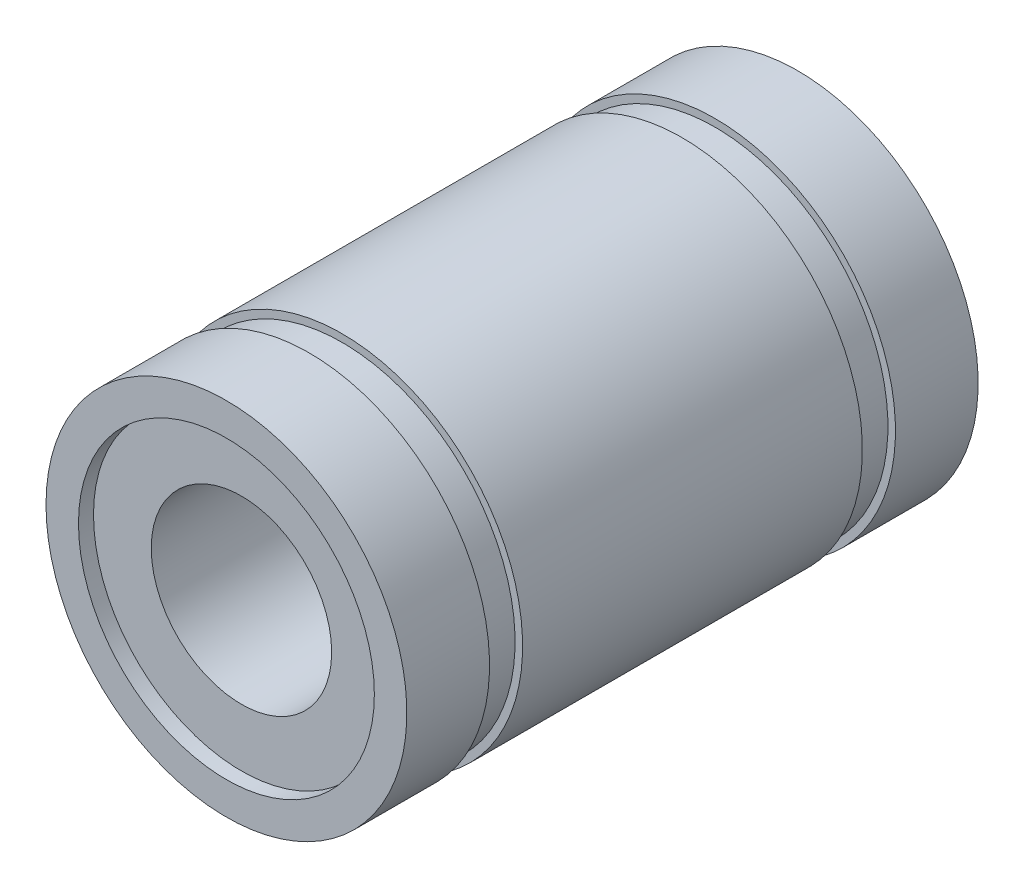
ISO-10303-21;
HEADER;
FILE_DESCRIPTION(('STEP AP214'),'2;1');
FILE_NAME('part.step','',(''),(''),'','','');
FILE_SCHEMA(('AUTOMOTIVE_DESIGN { 1 0 10303 214 1 1 1 1 }'));
ENDSEC;
DATA;
#1=APPLICATION_CONTEXT('core data for automotive mechanical design processes');
#2=APPLICATION_PROTOCOL_DEFINITION('international standard','automotive_design',2000,#1);
#3=PRODUCT_CONTEXT('',#1,'mechanical');
#4=PRODUCT('Part','Part','',(#3));
#5=PRODUCT_RELATED_PRODUCT_CATEGORY('part','',(#4));
#6=PRODUCT_DEFINITION_FORMATION('','',#4);
#7=PRODUCT_DEFINITION_CONTEXT('part definition',#1,'design');
#8=PRODUCT_DEFINITION('design','',#6,#7);
#9=PRODUCT_DEFINITION_SHAPE('','',#8);
#10=(LENGTH_UNIT() NAMED_UNIT(*) SI_UNIT(.MILLI.,.METRE.));
#11=(NAMED_UNIT(*) PLANE_ANGLE_UNIT() SI_UNIT($,.RADIAN.));
#12=(NAMED_UNIT(*) SI_UNIT($,.STERADIAN.) SOLID_ANGLE_UNIT());
#13=UNCERTAINTY_MEASURE_WITH_UNIT(LENGTH_MEASURE(1.E-05),#10,'distance_accuracy_value','');
#14=(GEOMETRIC_REPRESENTATION_CONTEXT(3) GLOBAL_UNCERTAINTY_ASSIGNED_CONTEXT((#13)) GLOBAL_UNIT_ASSIGNED_CONTEXT((#10,
#11,#12)) REPRESENTATION_CONTEXT('',''));
#15=CARTESIAN_POINT('',(0.,0.,0.));
#16=DIRECTION('',(0.,0.,1.));
#17=DIRECTION('',(1.,0.,0.));
#18=AXIS2_PLACEMENT_3D('',#15,#16,#17);
#19=CARTESIAN_POINT('',(5.75,0.,16.25));
#20=DIRECTION('',(0.,0.,-1.));
#21=DIRECTION('',(-1.,0.,0.));
#22=AXIS2_PLACEMENT_3D('',#19,#20,#21);
#23=PLANE('',#22);
#24=CARTESIAN_POINT('',(0.,0.,16.25));
#25=DIRECTION('',(0.,0.,-1.));
#26=DIRECTION('',(-1.,0.,0.));
#27=AXIS2_PLACEMENT_3D('',#24,#25,#26);
#28=CIRCLE('',#27,6.);
#29=CARTESIAN_POINT('',(-6.,0.,16.25));
#30=VERTEX_POINT('',#29);
#31=EDGE_CURVE('E10',#30,#30,#28,.T.);
#32=ORIENTED_EDGE('',*,*,#31,.T.);
#33=EDGE_LOOP('',(#32));
#34=FACE_BOUND('',#33,.T.);
#35=CARTESIAN_POINT('',(0.,0.,16.25));
#36=DIRECTION('',(0.,0.,-1.));
#37=DIRECTION('',(-1.,0.,0.));
#38=AXIS2_PLACEMENT_3D('',#35,#36,#37);
#39=CIRCLE('',#38,5.75);
#40=CARTESIAN_POINT('',(-5.75,0.,16.25));
#41=VERTEX_POINT('',#40);
#42=EDGE_CURVE('E107',#41,#41,#39,.T.);
#43=ORIENTED_EDGE('',*,*,#42,.F.);
#44=EDGE_LOOP('',(#43));
#45=FACE_BOUND('',#44,.T.);
#46=ADVANCED_FACE('F40',(#34,#45),#23,.T.);
#47=CARTESIAN_POINT('',(0.,0.,19.));
#48=DIRECTION('',(0.,0.,-1.));
#49=DIRECTION('',(-1.,0.,0.));
#50=AXIS2_PLACEMENT_3D('',#47,#48,#49);
#51=CYLINDRICAL_SURFACE('',#50,6.);
#52=CARTESIAN_POINT('',(0.,0.,19.));
#53=DIRECTION('',(0.,0.,-1.));
#54=DIRECTION('',(-1.,0.,0.));
#55=AXIS2_PLACEMENT_3D('',#52,#53,#54);
#56=CIRCLE('',#55,6.);
#57=CARTESIAN_POINT('',(-6.,0.,19.));
#58=VERTEX_POINT('',#57);
#59=EDGE_CURVE('E47',#58,#58,#56,.T.);
#60=ORIENTED_EDGE('',*,*,#59,.T.);
#61=EDGE_LOOP('',(#60));
#62=FACE_BOUND('',#61,.T.);
#63=ORIENTED_EDGE('',*,*,#31,.F.);
#64=EDGE_LOOP('',(#63));
#65=FACE_BOUND('',#64,.T.);
#66=ADVANCED_FACE('F116',(#62,#65),#51,.T.);
#67=CARTESIAN_POINT('',(6.,0.,19.));
#68=DIRECTION('',(0.,0.,1.));
#69=DIRECTION('',(1.,0.,0.));
#70=AXIS2_PLACEMENT_3D('',#67,#68,#69);
#71=PLANE('',#70);
#72=CARTESIAN_POINT('',(0.,0.,19.));
#73=DIRECTION('',(0.,0.,-1.));
#74=DIRECTION('',(-1.,0.,0.));
#75=AXIS2_PLACEMENT_3D('',#72,#73,#74);
#76=CIRCLE('',#75,4.92);
#77=CARTESIAN_POINT('',(-4.92,0.,19.));
#78=VERTEX_POINT('',#77);
#79=EDGE_CURVE('E52',#78,#78,#76,.T.);
#80=ORIENTED_EDGE('',*,*,#79,.T.);
#81=EDGE_LOOP('',(#80));
#82=FACE_BOUND('',#81,.T.);
#83=ORIENTED_EDGE('',*,*,#59,.F.);
#84=EDGE_LOOP('',(#83));
#85=FACE_BOUND('',#84,.T.);
#86=ADVANCED_FACE('F120',(#82,#85),#71,.T.);
#87=CARTESIAN_POINT('',(0.,0.,19.));
#88=DIRECTION('',(0.,0.,-1.));
#89=DIRECTION('',(-1.,0.,0.));
#90=AXIS2_PLACEMENT_3D('',#87,#88,#89);
#91=CYLINDRICAL_SURFACE('',#90,4.92);
#92=CARTESIAN_POINT('',(0.,0.,18.5));
#93=DIRECTION('',(0.,0.,-1.));
#94=DIRECTION('',(-1.,0.,0.));
#95=AXIS2_PLACEMENT_3D('',#92,#93,#94);
#96=CIRCLE('',#95,4.92);
#97=CARTESIAN_POINT('',(-4.92,0.,18.5));
#98=VERTEX_POINT('',#97);
#99=EDGE_CURVE('E57',#98,#98,#96,.T.);
#100=ORIENTED_EDGE('',*,*,#99,.T.);
#101=EDGE_LOOP('',(#100));
#102=FACE_BOUND('',#101,.T.);
#103=ORIENTED_EDGE('',*,*,#79,.F.);
#104=EDGE_LOOP('',(#103));
#105=FACE_BOUND('',#104,.T.);
#106=ADVANCED_FACE('F124',(#102,#105),#91,.F.);
#107=CARTESIAN_POINT('',(4.92,0.,18.5));
#108=DIRECTION('',(0.,0.,1.));
#109=DIRECTION('',(1.,0.,0.));
#110=AXIS2_PLACEMENT_3D('',#107,#108,#109);
#111=PLANE('',#110);
#112=CARTESIAN_POINT('',(0.,0.,18.5));
#113=DIRECTION('',(0.,0.,-1.));
#114=DIRECTION('',(-1.,0.,0.));
#115=AXIS2_PLACEMENT_3D('',#112,#113,#114);
#116=CIRCLE('',#115,3.);
#117=CARTESIAN_POINT('',(-3.,0.,18.5));
#118=VERTEX_POINT('',#117);
#119=EDGE_CURVE('E63',#118,#118,#116,.T.);
#120=ORIENTED_EDGE('',*,*,#119,.T.);
#121=EDGE_LOOP('',(#120));
#122=FACE_BOUND('',#121,.T.);
#123=ORIENTED_EDGE('',*,*,#99,.F.);
#124=EDGE_LOOP('',(#123));
#125=FACE_BOUND('',#124,.T.);
#126=ADVANCED_FACE('F131',(#122,#125),#111,.T.);
#127=CARTESIAN_POINT('',(0.,0.,19.));
#128=DIRECTION('',(0.,0.,-1.));
#129=DIRECTION('',(-1.,0.,0.));
#130=AXIS2_PLACEMENT_3D('',#127,#128,#129);
#131=CYLINDRICAL_SURFACE('',#130,3.);
#132=CARTESIAN_POINT('',(0.,0.,0.5));
#133=DIRECTION('',(0.,0.,-1.));
#134=DIRECTION('',(-1.,0.,0.));
#135=AXIS2_PLACEMENT_3D('',#132,#133,#134);
#136=CIRCLE('',#135,3.);
#137=CARTESIAN_POINT('',(-3.,0.,0.500000000000001));
#138=VERTEX_POINT('',#137);
#139=EDGE_CURVE('E67',#138,#138,#136,.T.);
#140=ORIENTED_EDGE('',*,*,#139,.T.);
#141=EDGE_LOOP('',(#140));
#142=FACE_BOUND('',#141,.T.);
#143=ORIENTED_EDGE('',*,*,#119,.F.);
#144=EDGE_LOOP('',(#143));
#145=FACE_BOUND('',#144,.T.);
#146=ADVANCED_FACE('F135',(#142,#145),#131,.F.);
#147=CARTESIAN_POINT('',(3.,0.,0.5));
#148=DIRECTION('',(0.,0.,-1.));
#149=DIRECTION('',(-1.,0.,0.));
#150=AXIS2_PLACEMENT_3D('',#147,#148,#149);
#151=PLANE('',#150);
#152=CARTESIAN_POINT('',(0.,0.,0.5));
#153=DIRECTION('',(0.,0.,-1.));
#154=DIRECTION('',(-1.,0.,0.));
#155=AXIS2_PLACEMENT_3D('',#152,#153,#154);
#156=CIRCLE('',#155,4.92);
#157=CARTESIAN_POINT('',(-4.92,0.,0.500000000000001));
#158=VERTEX_POINT('',#157);
#159=EDGE_CURVE('E71',#158,#158,#156,.T.);
#160=ORIENTED_EDGE('',*,*,#159,.T.);
#161=EDGE_LOOP('',(#160));
#162=FACE_BOUND('',#161,.T.);
#163=ORIENTED_EDGE('',*,*,#139,.F.);
#164=EDGE_LOOP('',(#163));
#165=FACE_BOUND('',#164,.T.);
#166=ADVANCED_FACE('F139',(#162,#165),#151,.T.);
#167=CARTESIAN_POINT('',(0.,0.,19.));
#168=DIRECTION('',(0.,0.,-1.));
#169=DIRECTION('',(-1.,0.,0.));
#170=AXIS2_PLACEMENT_3D('',#167,#168,#169);
#171=CYLINDRICAL_SURFACE('',#170,4.92);
#172=CARTESIAN_POINT('',(0.,0.,0.));
#173=DIRECTION('',(0.,0.,-1.));
#174=DIRECTION('',(-1.,0.,0.));
#175=AXIS2_PLACEMENT_3D('',#172,#173,#174);
#176=CIRCLE('',#175,4.92);
#177=CARTESIAN_POINT('',(-4.92,0.,0.));
#178=VERTEX_POINT('',#177);
#179=EDGE_CURVE('E75',#178,#178,#176,.T.);
#180=ORIENTED_EDGE('',*,*,#179,.T.);
#181=EDGE_LOOP('',(#180));
#182=FACE_BOUND('',#181,.T.);
#183=ORIENTED_EDGE('',*,*,#159,.F.);
#184=EDGE_LOOP('',(#183));
#185=FACE_BOUND('',#184,.T.);
#186=ADVANCED_FACE('F143',(#182,#185),#171,.F.);
#187=CARTESIAN_POINT('',(4.92,0.,0.));
#188=DIRECTION('',(0.,0.,-1.));
#189=DIRECTION('',(-1.,0.,0.));
#190=AXIS2_PLACEMENT_3D('',#187,#188,#189);
#191=PLANE('',#190);
#192=CARTESIAN_POINT('',(0.,0.,0.));
#193=DIRECTION('',(0.,0.,-1.));
#194=DIRECTION('',(-1.,0.,0.));
#195=AXIS2_PLACEMENT_3D('',#192,#193,#194);
#196=CIRCLE('',#195,6.);
#197=CARTESIAN_POINT('',(-6.,0.,0.));
#198=VERTEX_POINT('',#197);
#199=EDGE_CURVE('E79',#198,#198,#196,.T.);
#200=ORIENTED_EDGE('',*,*,#199,.T.);
#201=EDGE_LOOP('',(#200));
#202=FACE_BOUND('',#201,.T.);
#203=ORIENTED_EDGE('',*,*,#179,.F.);
#204=EDGE_LOOP('',(#203));
#205=FACE_BOUND('',#204,.T.);
#206=ADVANCED_FACE('F147',(#202,#205),#191,.T.);
#207=CARTESIAN_POINT('',(0.,0.,19.));
#208=DIRECTION('',(0.,0.,-1.));
#209=DIRECTION('',(-1.,0.,0.));
#210=AXIS2_PLACEMENT_3D('',#207,#208,#209);
#211=CYLINDRICAL_SURFACE('',#210,6.);
#212=CARTESIAN_POINT('',(0.,0.,2.75));
#213=DIRECTION('',(0.,0.,-1.));
#214=DIRECTION('',(-1.,0.,0.));
#215=AXIS2_PLACEMENT_3D('',#212,#213,#214);
#216=CIRCLE('',#215,6.);
#217=CARTESIAN_POINT('',(-6.,0.,2.75));
#218=VERTEX_POINT('',#217);
#219=EDGE_CURVE('E83',#218,#218,#216,.T.);
#220=ORIENTED_EDGE('',*,*,#219,.T.);
#221=EDGE_LOOP('',(#220));
#222=FACE_BOUND('',#221,.T.);
#223=ORIENTED_EDGE('',*,*,#199,.F.);
#224=EDGE_LOOP('',(#223));
#225=FACE_BOUND('',#224,.T.);
#226=ADVANCED_FACE('F151',(#222,#225),#211,.T.);
#227=CARTESIAN_POINT('',(6.,0.,2.75));
#228=DIRECTION('',(0.,0.,1.));
#229=DIRECTION('',(1.,0.,0.));
#230=AXIS2_PLACEMENT_3D('',#227,#228,#229);
#231=PLANE('',#230);
#232=CARTESIAN_POINT('',(0.,0.,2.75));
#233=DIRECTION('',(0.,0.,-1.));
#234=DIRECTION('',(-1.,0.,0.));
#235=AXIS2_PLACEMENT_3D('',#232,#233,#234);
#236=CIRCLE('',#235,5.75);
#237=CARTESIAN_POINT('',(-5.75,0.,2.75));
#238=VERTEX_POINT('',#237);
#239=EDGE_CURVE('E87',#238,#238,#236,.T.);
#240=ORIENTED_EDGE('',*,*,#239,.T.);
#241=EDGE_LOOP('',(#240));
#242=FACE_BOUND('',#241,.T.);
#243=ORIENTED_EDGE('',*,*,#219,.F.);
#244=EDGE_LOOP('',(#243));
#245=FACE_BOUND('',#244,.T.);
#246=ADVANCED_FACE('F155',(#242,#245),#231,.T.);
#247=CARTESIAN_POINT('',(0.,0.,19.));
#248=DIRECTION('',(0.,0.,-1.));
#249=DIRECTION('',(-1.,0.,0.));
#250=AXIS2_PLACEMENT_3D('',#247,#248,#249);
#251=CYLINDRICAL_SURFACE('',#250,5.75);
#252=CARTESIAN_POINT('',(0.,0.,3.85));
#253=DIRECTION('',(0.,0.,-1.));
#254=DIRECTION('',(-1.,0.,0.));
#255=AXIS2_PLACEMENT_3D('',#252,#253,#254);
#256=CIRCLE('',#255,5.75);
#257=CARTESIAN_POINT('',(-5.75,0.,3.85));
#258=VERTEX_POINT('',#257);
#259=EDGE_CURVE('E91',#258,#258,#256,.T.);
#260=ORIENTED_EDGE('',*,*,#259,.T.);
#261=EDGE_LOOP('',(#260));
#262=FACE_BOUND('',#261,.T.);
#263=ORIENTED_EDGE('',*,*,#239,.F.);
#264=EDGE_LOOP('',(#263));
#265=FACE_BOUND('',#264,.T.);
#266=ADVANCED_FACE('F159',(#262,#265),#251,.T.);
#267=CARTESIAN_POINT('',(5.75,0.,3.85));
#268=DIRECTION('',(0.,0.,-1.));
#269=DIRECTION('',(-1.,0.,0.));
#270=AXIS2_PLACEMENT_3D('',#267,#268,#269);
#271=PLANE('',#270);
#272=CARTESIAN_POINT('',(0.,0.,3.85));
#273=DIRECTION('',(0.,0.,-1.));
#274=DIRECTION('',(-1.,0.,0.));
#275=AXIS2_PLACEMENT_3D('',#272,#273,#274);
#276=CIRCLE('',#275,6.);
#277=CARTESIAN_POINT('',(-6.,0.,3.85));
#278=VERTEX_POINT('',#277);
#279=EDGE_CURVE('E95',#278,#278,#276,.T.);
#280=ORIENTED_EDGE('',*,*,#279,.T.);
#281=EDGE_LOOP('',(#280));
#282=FACE_BOUND('',#281,.T.);
#283=ORIENTED_EDGE('',*,*,#259,.F.);
#284=EDGE_LOOP('',(#283));
#285=FACE_BOUND('',#284,.T.);
#286=ADVANCED_FACE('F163',(#282,#285),#271,.T.);
#287=CARTESIAN_POINT('',(0.,0.,19.));
#288=DIRECTION('',(0.,0.,-1.));
#289=DIRECTION('',(-1.,0.,0.));
#290=AXIS2_PLACEMENT_3D('',#287,#288,#289);
#291=CYLINDRICAL_SURFACE('',#290,6.);
#292=CARTESIAN_POINT('',(0.,0.,15.15));
#293=DIRECTION('',(0.,0.,-1.));
#294=DIRECTION('',(-1.,0.,0.));
#295=AXIS2_PLACEMENT_3D('',#292,#293,#294);
#296=CIRCLE('',#295,6.);
#297=CARTESIAN_POINT('',(-6.,0.,15.15));
#298=VERTEX_POINT('',#297);
#299=EDGE_CURVE('E99',#298,#298,#296,.T.);
#300=ORIENTED_EDGE('',*,*,#299,.T.);
#301=EDGE_LOOP('',(#300));
#302=FACE_BOUND('',#301,.T.);
#303=ORIENTED_EDGE('',*,*,#279,.F.);
#304=EDGE_LOOP('',(#303));
#305=FACE_BOUND('',#304,.T.);
#306=ADVANCED_FACE('F167',(#302,#305),#291,.T.);
#307=CARTESIAN_POINT('',(6.,0.,15.15));
#308=DIRECTION('',(0.,0.,1.));
#309=DIRECTION('',(1.,0.,0.));
#310=AXIS2_PLACEMENT_3D('',#307,#308,#309);
#311=PLANE('',#310);
#312=CARTESIAN_POINT('',(0.,0.,15.15));
#313=DIRECTION('',(0.,0.,-1.));
#314=DIRECTION('',(-1.,0.,0.));
#315=AXIS2_PLACEMENT_3D('',#312,#313,#314);
#316=CIRCLE('',#315,5.75);
#317=CARTESIAN_POINT('',(-5.75,0.,15.15));
#318=VERTEX_POINT('',#317);
#319=EDGE_CURVE('E103',#318,#318,#316,.T.);
#320=ORIENTED_EDGE('',*,*,#319,.T.);
#321=EDGE_LOOP('',(#320));
#322=FACE_BOUND('',#321,.T.);
#323=ORIENTED_EDGE('',*,*,#299,.F.);
#324=EDGE_LOOP('',(#323));
#325=FACE_BOUND('',#324,.T.);
#326=ADVANCED_FACE('F171',(#322,#325),#311,.T.);
#327=CARTESIAN_POINT('',(0.,0.,19.));
#328=DIRECTION('',(0.,0.,-1.));
#329=DIRECTION('',(-1.,0.,0.));
#330=AXIS2_PLACEMENT_3D('',#327,#328,#329);
#331=CYLINDRICAL_SURFACE('',#330,5.75);
#332=ORIENTED_EDGE('',*,*,#42,.T.);
#333=EDGE_LOOP('',(#332));
#334=FACE_BOUND('',#333,.T.);
#335=ORIENTED_EDGE('',*,*,#319,.F.);
#336=EDGE_LOOP('',(#335));
#337=FACE_BOUND('',#336,.T.);
#338=ADVANCED_FACE('F112',(#334,#337),#331,.T.);
#339=CLOSED_SHELL('',(#46,#66,#86,#106,#126,#146,#166,#186,#206,#226,#246,#266,#286,#306,#326,#338));
#340=MANIFOLD_SOLID_BREP('B2',#339);
#341=ADVANCED_BREP_SHAPE_REPRESENTATION('',(#18,#340),#14);
#342=SHAPE_DEFINITION_REPRESENTATION(#9,#341);
ENDSEC;
END-ISO-10303-21;
